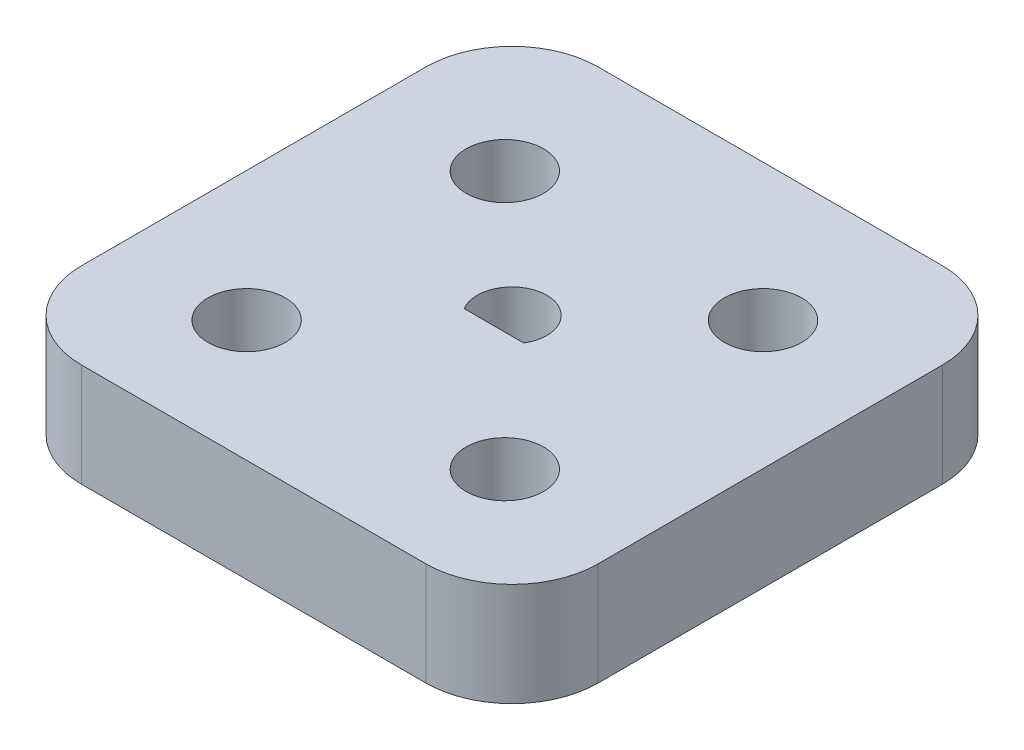
ISO-10303-21;
HEADER;
FILE_DESCRIPTION(('STEP AP214'),'2;1');
FILE_NAME('part.step','',(''),(''),'','','');
FILE_SCHEMA(('AUTOMOTIVE_DESIGN { 1 0 10303 214 1 1 1 1 }'));
ENDSEC;
DATA;
#1=APPLICATION_CONTEXT('core data for automotive mechanical design processes');
#2=APPLICATION_PROTOCOL_DEFINITION('international standard','automotive_design',2000,#1);
#3=PRODUCT_CONTEXT('',#1,'mechanical');
#4=PRODUCT('Part','Part','',(#3));
#5=PRODUCT_RELATED_PRODUCT_CATEGORY('part','',(#4));
#6=PRODUCT_DEFINITION_FORMATION('','',#4);
#7=PRODUCT_DEFINITION_CONTEXT('part definition',#1,'design');
#8=PRODUCT_DEFINITION('design','',#6,#7);
#9=PRODUCT_DEFINITION_SHAPE('','',#8);
#10=(LENGTH_UNIT() NAMED_UNIT(*) SI_UNIT(.MILLI.,.METRE.));
#11=(NAMED_UNIT(*) PLANE_ANGLE_UNIT() SI_UNIT($,.RADIAN.));
#12=(NAMED_UNIT(*) SI_UNIT($,.STERADIAN.) SOLID_ANGLE_UNIT());
#13=UNCERTAINTY_MEASURE_WITH_UNIT(LENGTH_MEASURE(1.E-05),#10,'distance_accuracy_value','');
#14=(GEOMETRIC_REPRESENTATION_CONTEXT(3) GLOBAL_UNCERTAINTY_ASSIGNED_CONTEXT((#13)) GLOBAL_UNIT_ASSIGNED_CONTEXT((#10,
#11,#12)) REPRESENTATION_CONTEXT('',''));
#15=CARTESIAN_POINT('',(0.,0.,0.));
#16=DIRECTION('',(0.,0.,1.));
#17=DIRECTION('',(1.,0.,0.));
#18=AXIS2_PLACEMENT_3D('',#15,#16,#17);
#19=CARTESIAN_POINT('',(15.,6.,0.));
#20=DIRECTION('',(1.,0.,0.));
#21=DIRECTION('',(0.,0.,-1.));
#22=AXIS2_PLACEMENT_3D('',#19,#20,#21);
#23=PLANE('',#22);
#24=DIRECTION('',(0.,0.,1.));
#25=VECTOR('',#24,1.);
#26=CARTESIAN_POINT('',(15.,0.,0.));
#27=LINE('',#26,#25);
#28=CARTESIAN_POINT('',(15.,0.,-10.));
#29=VERTEX_POINT('',#28);
#30=CARTESIAN_POINT('',(15.,0.,10.));
#31=VERTEX_POINT('',#30);
#32=EDGE_CURVE('E150',#29,#31,#27,.T.);
#33=ORIENTED_EDGE('',*,*,#32,.F.);
#34=DIRECTION('',(0.,-1.,0.));
#35=VECTOR('',#34,1.);
#36=CARTESIAN_POINT('',(15.,6.,-10.));
#37=LINE('',#36,#35);
#38=CARTESIAN_POINT('',(15.,6.,-10.));
#39=VERTEX_POINT('',#38);
#40=EDGE_CURVE('E188',#29,#39,#37,.F.);
#41=ORIENTED_EDGE('',*,*,#40,.T.);
#42=DIRECTION('',(0.,0.,1.));
#43=VECTOR('',#42,1.);
#44=CARTESIAN_POINT('',(15.,6.,0.));
#45=LINE('',#44,#43);
#46=CARTESIAN_POINT('',(15.,6.,10.));
#47=VERTEX_POINT('',#46);
#48=EDGE_CURVE('E133',#39,#47,#45,.T.);
#49=ORIENTED_EDGE('',*,*,#48,.T.);
#50=DIRECTION('',(0.,-1.,0.));
#51=VECTOR('',#50,1.);
#52=CARTESIAN_POINT('',(15.,0.,10.));
#53=LINE('',#52,#51);
#54=EDGE_CURVE('E185',#47,#31,#53,.T.);
#55=ORIENTED_EDGE('',*,*,#54,.T.);
#56=EDGE_LOOP('',(#33,#41,#49,#55));
#57=FACE_BOUND('',#56,.T.);
#58=ADVANCED_FACE('F35',(#57),#23,.T.);
#59=CARTESIAN_POINT('',(0.,6.,-15.));
#60=DIRECTION('',(0.,0.,-1.));
#61=DIRECTION('',(-1.,0.,0.));
#62=AXIS2_PLACEMENT_3D('',#59,#60,#61);
#63=PLANE('',#62);
#64=DIRECTION('',(1.,0.,0.));
#65=VECTOR('',#64,1.);
#66=CARTESIAN_POINT('',(0.,0.,-15.));
#67=LINE('',#66,#65);
#68=CARTESIAN_POINT('',(-10.,0.,-15.));
#69=VERTEX_POINT('',#68);
#70=CARTESIAN_POINT('',(10.,0.,-15.));
#71=VERTEX_POINT('',#70);
#72=EDGE_CURVE('E153',#69,#71,#67,.T.);
#73=ORIENTED_EDGE('',*,*,#72,.F.);
#74=DIRECTION('',(0.,-1.,0.));
#75=VECTOR('',#74,1.);
#76=CARTESIAN_POINT('',(-10.,6.,-15.));
#77=LINE('',#76,#75);
#78=CARTESIAN_POINT('',(-10.,6.,-15.));
#79=VERTEX_POINT('',#78);
#80=EDGE_CURVE('E176',#69,#79,#77,.F.);
#81=ORIENTED_EDGE('',*,*,#80,.T.);
#82=DIRECTION('',(1.,0.,0.));
#83=VECTOR('',#82,1.);
#84=CARTESIAN_POINT('',(0.,6.,-15.));
#85=LINE('',#84,#83);
#86=CARTESIAN_POINT('',(10.,6.,-15.));
#87=VERTEX_POINT('',#86);
#88=EDGE_CURVE('E136',#79,#87,#85,.T.);
#89=ORIENTED_EDGE('',*,*,#88,.T.);
#90=DIRECTION('',(0.,-1.,0.));
#91=VECTOR('',#90,1.);
#92=CARTESIAN_POINT('',(10.,6.,-15.));
#93=LINE('',#92,#91);
#94=EDGE_CURVE('E173',#87,#71,#93,.T.);
#95=ORIENTED_EDGE('',*,*,#94,.T.);
#96=EDGE_LOOP('',(#73,#81,#89,#95));
#97=FACE_BOUND('',#96,.T.);
#98=ADVANCED_FACE('F202',(#97),#63,.T.);
#99=CARTESIAN_POINT('',(-15.,6.,0.));
#100=DIRECTION('',(1.,0.,0.));
#101=DIRECTION('',(0.,0.,-1.));
#102=AXIS2_PLACEMENT_3D('',#99,#100,#101);
#103=PLANE('',#102);
#104=DIRECTION('',(0.,0.,1.));
#105=VECTOR('',#104,1.);
#106=CARTESIAN_POINT('',(-15.,6.,0.));
#107=LINE('',#106,#105);
#108=CARTESIAN_POINT('',(-15.,6.,-10.));
#109=VERTEX_POINT('',#108);
#110=CARTESIAN_POINT('',(-15.,6.,10.));
#111=VERTEX_POINT('',#110);
#112=EDGE_CURVE('E142',#109,#111,#107,.T.);
#113=ORIENTED_EDGE('',*,*,#112,.F.);
#114=DIRECTION('',(0.,-1.,0.));
#115=VECTOR('',#114,1.);
#116=CARTESIAN_POINT('',(-15.,0.,-10.));
#117=LINE('',#116,#115);
#118=CARTESIAN_POINT('',(-15.,0.,-10.));
#119=VERTEX_POINT('',#118);
#120=EDGE_CURVE('E162',#109,#119,#117,.T.);
#121=ORIENTED_EDGE('',*,*,#120,.T.);
#122=DIRECTION('',(0.,0.,1.));
#123=VECTOR('',#122,1.);
#124=CARTESIAN_POINT('',(-15.,0.,0.));
#125=LINE('',#124,#123);
#126=CARTESIAN_POINT('',(-15.,0.,10.));
#127=VERTEX_POINT('',#126);
#128=EDGE_CURVE('E156',#119,#127,#125,.T.);
#129=ORIENTED_EDGE('',*,*,#128,.T.);
#130=DIRECTION('',(0.,-1.,0.));
#131=VECTOR('',#130,1.);
#132=CARTESIAN_POINT('',(-15.,6.,10.));
#133=LINE('',#132,#131);
#134=EDGE_CURVE('E124',#127,#111,#133,.F.);
#135=ORIENTED_EDGE('',*,*,#134,.T.);
#136=EDGE_LOOP('',(#113,#121,#129,#135));
#137=FACE_BOUND('',#136,.T.);
#138=ADVANCED_FACE('F213',(#137),#103,.F.);
#139=CARTESIAN_POINT('',(0.,6.,0.));
#140=DIRECTION('',(0.,-1.,0.));
#141=DIRECTION('',(0.,0.,-1.));
#142=AXIS2_PLACEMENT_3D('',#139,#140,#141);
#143=CYLINDRICAL_SURFACE('',#142,2.025);
#144=CARTESIAN_POINT('',(0.,0.,0.));
#145=DIRECTION('',(0.,1.,0.));
#146=DIRECTION('',(0.,0.,1.));
#147=AXIS2_PLACEMENT_3D('',#144,#145,#146);
#148=CIRCLE('',#147,2.025);
#149=CARTESIAN_POINT('',(1.73150945709228,0.,1.05));
#150=VERTEX_POINT('',#149);
#151=CARTESIAN_POINT('',(-1.73150945709228,0.,1.05));
#152=VERTEX_POINT('',#151);
#153=EDGE_CURVE('E119',#150,#152,#148,.T.);
#154=ORIENTED_EDGE('',*,*,#153,.F.);
#155=DIRECTION('',(0.,-1.,0.));
#156=VECTOR('',#155,1.);
#157=CARTESIAN_POINT('',(1.73150945709228,6.,1.05));
#158=LINE('',#157,#156);
#159=CARTESIAN_POINT('',(1.73150945709228,6.,1.05));
#160=VERTEX_POINT('',#159);
#161=EDGE_CURVE('E113',#160,#150,#158,.T.);
#162=ORIENTED_EDGE('',*,*,#161,.F.);
#163=CARTESIAN_POINT('',(0.,6.,0.));
#164=DIRECTION('',(0.,1.,0.));
#165=DIRECTION('',(0.,0.,1.));
#166=AXIS2_PLACEMENT_3D('',#163,#164,#165);
#167=CIRCLE('',#166,2.025);
#168=CARTESIAN_POINT('',(-1.73150945709228,6.,1.05));
#169=VERTEX_POINT('',#168);
#170=EDGE_CURVE('E116',#160,#169,#167,.T.);
#171=ORIENTED_EDGE('',*,*,#170,.T.);
#172=DIRECTION('',(0.,-1.,0.));
#173=VECTOR('',#172,1.);
#174=CARTESIAN_POINT('',(-1.73150945709228,6.,1.05));
#175=LINE('',#174,#173);
#176=EDGE_CURVE('E125',#169,#152,#175,.T.);
#177=ORIENTED_EDGE('',*,*,#176,.T.);
#178=EDGE_LOOP('',(#154,#162,#171,#177));
#179=FACE_BOUND('',#178,.T.);
#180=ADVANCED_FACE('F115',(#179),#143,.F.);
#181=CARTESIAN_POINT('',(0.,6.,1.05));
#182=DIRECTION('',(0.,0.,-1.));
#183=DIRECTION('',(-1.,0.,0.));
#184=AXIS2_PLACEMENT_3D('',#181,#182,#183);
#185=PLANE('',#184);
#186=DIRECTION('',(1.,0.,0.));
#187=VECTOR('',#186,1.);
#188=CARTESIAN_POINT('',(0.,0.,1.05));
#189=LINE('',#188,#187);
#190=EDGE_CURVE('E147',#152,#150,#189,.T.);
#191=ORIENTED_EDGE('',*,*,#190,.F.);
#192=ORIENTED_EDGE('',*,*,#176,.F.);
#193=DIRECTION('',(1.,0.,0.));
#194=VECTOR('',#193,1.);
#195=CARTESIAN_POINT('',(0.,6.,1.05));
#196=LINE('',#195,#194);
#197=EDGE_CURVE('E129',#169,#160,#196,.T.);
#198=ORIENTED_EDGE('',*,*,#197,.T.);
#199=ORIENTED_EDGE('',*,*,#161,.T.);
#200=EDGE_LOOP('',(#191,#192,#198,#199));
#201=FACE_BOUND('',#200,.T.);
#202=ADVANCED_FACE('F132',(#201),#185,.T.);
#203=CARTESIAN_POINT('',(0.,6.,15.));
#204=DIRECTION('',(0.,0.,-1.));
#205=DIRECTION('',(-1.,0.,0.));
#206=AXIS2_PLACEMENT_3D('',#203,#204,#205);
#207=PLANE('',#206);
#208=DIRECTION('',(1.,0.,0.));
#209=VECTOR('',#208,1.);
#210=CARTESIAN_POINT('',(0.,6.,15.));
#211=LINE('',#210,#209);
#212=CARTESIAN_POINT('',(-10.,6.,15.));
#213=VERTEX_POINT('',#212);
#214=CARTESIAN_POINT('',(10.,6.,15.));
#215=VERTEX_POINT('',#214);
#216=EDGE_CURVE('E144',#213,#215,#211,.T.);
#217=ORIENTED_EDGE('',*,*,#216,.F.);
#218=DIRECTION('',(0.,-1.,0.));
#219=VECTOR('',#218,1.);
#220=CARTESIAN_POINT('',(-10.,6.,15.));
#221=LINE('',#220,#219);
#222=CARTESIAN_POINT('',(-10.,0.,15.));
#223=VERTEX_POINT('',#222);
#224=EDGE_CURVE('E11',#213,#223,#221,.T.);
#225=ORIENTED_EDGE('',*,*,#224,.T.);
#226=DIRECTION('',(1.,0.,0.));
#227=VECTOR('',#226,1.);
#228=CARTESIAN_POINT('',(0.,0.,15.));
#229=LINE('',#228,#227);
#230=CARTESIAN_POINT('',(10.,0.,15.));
#231=VERTEX_POINT('',#230);
#232=EDGE_CURVE('E130',#223,#231,#229,.T.);
#233=ORIENTED_EDGE('',*,*,#232,.T.);
#234=DIRECTION('',(0.,-1.,0.));
#235=VECTOR('',#234,1.);
#236=CARTESIAN_POINT('',(10.,6.,15.));
#237=LINE('',#236,#235);
#238=EDGE_CURVE('E43',#231,#215,#237,.F.);
#239=ORIENTED_EDGE('',*,*,#238,.T.);
#240=EDGE_LOOP('',(#217,#225,#233,#239));
#241=FACE_BOUND('',#240,.T.);
#242=ADVANCED_FACE('F219',(#241),#207,.F.);
#243=CARTESIAN_POINT('',(0.,6.,0.));
#244=DIRECTION('',(0.,1.,0.));
#245=DIRECTION('',(0.,0.,1.));
#246=AXIS2_PLACEMENT_3D('',#243,#244,#245);
#247=PLANE('',#246);
#248=CARTESIAN_POINT('',(-7.46768441613738,6.,-7.05158171030384));
#249=DIRECTION('',(0.,1.,0.));
#250=DIRECTION('',(0.,0.,1.));
#251=AXIS2_PLACEMENT_3D('',#248,#249,#250);
#252=CIRCLE('',#251,2.2479);
#253=CARTESIAN_POINT('',(-7.46768441613738,6.,-4.80368171030385));
#254=VERTEX_POINT('',#253);
#255=EDGE_CURVE('E367',#254,#254,#252,.T.);
#256=ORIENTED_EDGE('',*,*,#255,.F.);
#257=EDGE_LOOP('',(#256));
#258=FACE_BOUND('',#257,.T.);
#259=CARTESIAN_POINT('',(7.53231558386262,6.,-7.05158171030384));
#260=DIRECTION('',(0.,1.,0.));
#261=DIRECTION('',(0.,0.,1.));
#262=AXIS2_PLACEMENT_3D('',#259,#260,#261);
#263=CIRCLE('',#262,2.2479);
#264=CARTESIAN_POINT('',(7.53231558386262,6.,-4.80368171030384));
#265=VERTEX_POINT('',#264);
#266=EDGE_CURVE('E369',#265,#265,#263,.T.);
#267=ORIENTED_EDGE('',*,*,#266,.F.);
#268=EDGE_LOOP('',(#267));
#269=FACE_BOUND('',#268,.T.);
#270=CARTESIAN_POINT('',(-7.46768441613738,6.,7.94841828969615));
#271=DIRECTION('',(0.,1.,0.));
#272=DIRECTION('',(0.,0.,1.));
#273=AXIS2_PLACEMENT_3D('',#270,#271,#272);
#274=CIRCLE('',#273,2.2479);
#275=CARTESIAN_POINT('',(-7.46768441613738,6.,10.1963182896962));
#276=VERTEX_POINT('',#275);
#277=EDGE_CURVE('E377',#276,#276,#274,.T.);
#278=ORIENTED_EDGE('',*,*,#277,.F.);
#279=EDGE_LOOP('',(#278));
#280=FACE_BOUND('',#279,.T.);
#281=CARTESIAN_POINT('',(7.53231558386262,6.,7.94841828969615));
#282=DIRECTION('',(0.,1.,0.));
#283=DIRECTION('',(0.,0.,1.));
#284=AXIS2_PLACEMENT_3D('',#281,#282,#283);
#285=CIRCLE('',#284,2.2479);
#286=CARTESIAN_POINT('',(7.53231558386262,6.,10.1963182896962));
#287=VERTEX_POINT('',#286);
#288=EDGE_CURVE('E383',#287,#287,#285,.T.);
#289=ORIENTED_EDGE('',*,*,#288,.F.);
#290=EDGE_LOOP('',(#289));
#291=FACE_BOUND('',#290,.T.);
#292=ORIENTED_EDGE('',*,*,#170,.F.);
#293=ORIENTED_EDGE('',*,*,#197,.F.);
#294=EDGE_LOOP('',(#292,#293));
#295=FACE_BOUND('',#294,.T.);
#296=ORIENTED_EDGE('',*,*,#88,.F.);
#297=CARTESIAN_POINT('',(-10.,6.,-10.));
#298=DIRECTION('',(0.,1.,0.));
#299=DIRECTION('',(0.,0.,1.));
#300=AXIS2_PLACEMENT_3D('',#297,#298,#299);
#301=CIRCLE('',#300,5.);
#302=EDGE_CURVE('E183',#79,#109,#301,.T.);
#303=ORIENTED_EDGE('',*,*,#302,.T.);
#304=ORIENTED_EDGE('',*,*,#112,.T.);
#305=CARTESIAN_POINT('',(-10.,6.,10.));
#306=DIRECTION('',(0.,1.,0.));
#307=DIRECTION('',(0.,0.,1.));
#308=AXIS2_PLACEMENT_3D('',#305,#306,#307);
#309=CIRCLE('',#308,5.);
#310=EDGE_CURVE('E56',#111,#213,#309,.T.);
#311=ORIENTED_EDGE('',*,*,#310,.T.);
#312=ORIENTED_EDGE('',*,*,#216,.T.);
#313=CARTESIAN_POINT('',(10.,6.,10.));
#314=DIRECTION('',(0.,1.,0.));
#315=DIRECTION('',(0.,0.,1.));
#316=AXIS2_PLACEMENT_3D('',#313,#314,#315);
#317=CIRCLE('',#316,5.);
#318=EDGE_CURVE('E178',#215,#47,#317,.T.);
#319=ORIENTED_EDGE('',*,*,#318,.T.);
#320=ORIENTED_EDGE('',*,*,#48,.F.);
#321=CARTESIAN_POINT('',(10.,6.,-10.));
#322=DIRECTION('',(0.,1.,0.));
#323=DIRECTION('',(0.,0.,1.));
#324=AXIS2_PLACEMENT_3D('',#321,#322,#323);
#325=CIRCLE('',#324,5.);
#326=EDGE_CURVE('E181',#39,#87,#325,.T.);
#327=ORIENTED_EDGE('',*,*,#326,.T.);
#328=EDGE_LOOP('',(#296,#303,#304,#311,#312,#319,#320,#327));
#329=FACE_BOUND('',#328,.T.);
#330=ADVANCED_FACE('F128',(#258,#269,#280,#291,#295,#329),#247,.T.);
#331=CARTESIAN_POINT('',(0.,0.,0.));
#332=DIRECTION('',(0.,1.,0.));
#333=DIRECTION('',(0.,0.,1.));
#334=AXIS2_PLACEMENT_3D('',#331,#332,#333);
#335=PLANE('',#334);
#336=CARTESIAN_POINT('',(-7.46768441613738,0.,-7.05158171030384));
#337=DIRECTION('',(0.,1.,0.));
#338=DIRECTION('',(0.,0.,1.));
#339=AXIS2_PLACEMENT_3D('',#336,#337,#338);
#340=CIRCLE('',#339,2.2479);
#341=CARTESIAN_POINT('',(-7.46768441613738,0.,-4.80368171030385));
#342=VERTEX_POINT('',#341);
#343=EDGE_CURVE('E364',#342,#342,#340,.T.);
#344=ORIENTED_EDGE('',*,*,#343,.T.);
#345=EDGE_LOOP('',(#344));
#346=FACE_BOUND('',#345,.T.);
#347=CARTESIAN_POINT('',(7.53231558386262,0.,-7.05158171030384));
#348=DIRECTION('',(0.,1.,0.));
#349=DIRECTION('',(0.,0.,1.));
#350=AXIS2_PLACEMENT_3D('',#347,#348,#349);
#351=CIRCLE('',#350,2.2479);
#352=CARTESIAN_POINT('',(7.53231558386262,0.,-4.80368171030385));
#353=VERTEX_POINT('',#352);
#354=EDGE_CURVE('E374',#353,#353,#351,.T.);
#355=ORIENTED_EDGE('',*,*,#354,.T.);
#356=EDGE_LOOP('',(#355));
#357=FACE_BOUND('',#356,.T.);
#358=CARTESIAN_POINT('',(-7.46768441613738,0.,7.94841828969615));
#359=DIRECTION('',(0.,1.,0.));
#360=DIRECTION('',(0.,0.,1.));
#361=AXIS2_PLACEMENT_3D('',#358,#359,#360);
#362=CIRCLE('',#361,2.2479);
#363=CARTESIAN_POINT('',(-7.46768441613738,0.,10.1963182896962));
#364=VERTEX_POINT('',#363);
#365=EDGE_CURVE('E380',#364,#364,#362,.T.);
#366=ORIENTED_EDGE('',*,*,#365,.T.);
#367=EDGE_LOOP('',(#366));
#368=FACE_BOUND('',#367,.T.);
#369=CARTESIAN_POINT('',(7.53231558386262,0.,7.94841828969615));
#370=DIRECTION('',(0.,1.,0.));
#371=DIRECTION('',(0.,0.,1.));
#372=AXIS2_PLACEMENT_3D('',#369,#370,#371);
#373=CIRCLE('',#372,2.2479);
#374=CARTESIAN_POINT('',(7.53231558386262,0.,10.1963182896962));
#375=VERTEX_POINT('',#374);
#376=EDGE_CURVE('E148',#375,#375,#373,.T.);
#377=ORIENTED_EDGE('',*,*,#376,.T.);
#378=EDGE_LOOP('',(#377));
#379=FACE_BOUND('',#378,.T.);
#380=ORIENTED_EDGE('',*,*,#153,.T.);
#381=ORIENTED_EDGE('',*,*,#190,.T.);
#382=EDGE_LOOP('',(#380,#381));
#383=FACE_BOUND('',#382,.T.);
#384=ORIENTED_EDGE('',*,*,#128,.F.);
#385=CARTESIAN_POINT('',(-10.,0.,-10.));
#386=DIRECTION('',(0.,1.,0.));
#387=DIRECTION('',(0.,0.,1.));
#388=AXIS2_PLACEMENT_3D('',#385,#386,#387);
#389=CIRCLE('',#388,5.);
#390=EDGE_CURVE('E171',#119,#69,#389,.F.);
#391=ORIENTED_EDGE('',*,*,#390,.T.);
#392=ORIENTED_EDGE('',*,*,#72,.T.);
#393=CARTESIAN_POINT('',(10.,0.,-10.));
#394=DIRECTION('',(0.,1.,0.));
#395=DIRECTION('',(0.,0.,1.));
#396=AXIS2_PLACEMENT_3D('',#393,#394,#395);
#397=CIRCLE('',#396,5.);
#398=EDGE_CURVE('E169',#71,#29,#397,.F.);
#399=ORIENTED_EDGE('',*,*,#398,.T.);
#400=ORIENTED_EDGE('',*,*,#32,.T.);
#401=CARTESIAN_POINT('',(10.,0.,10.));
#402=DIRECTION('',(0.,1.,0.));
#403=DIRECTION('',(0.,0.,1.));
#404=AXIS2_PLACEMENT_3D('',#401,#402,#403);
#405=CIRCLE('',#404,5.);
#406=EDGE_CURVE('E165',#31,#231,#405,.F.);
#407=ORIENTED_EDGE('',*,*,#406,.T.);
#408=ORIENTED_EDGE('',*,*,#232,.F.);
#409=CARTESIAN_POINT('',(-10.,0.,10.));
#410=DIRECTION('',(0.,1.,0.));
#411=DIRECTION('',(0.,0.,1.));
#412=AXIS2_PLACEMENT_3D('',#409,#410,#411);
#413=CIRCLE('',#412,5.);
#414=EDGE_CURVE('E167',#223,#127,#413,.F.);
#415=ORIENTED_EDGE('',*,*,#414,.T.);
#416=EDGE_LOOP('',(#384,#391,#392,#399,#400,#407,#408,#415));
#417=FACE_BOUND('',#416,.T.);
#418=ADVANCED_FACE('F206',(#346,#357,#368,#379,#383,#417),#335,.F.);
#419=CARTESIAN_POINT('',(-10.,6.,-10.));
#420=DIRECTION('',(0.,1.,0.));
#421=DIRECTION('',(0.,0.,1.));
#422=AXIS2_PLACEMENT_3D('',#419,#420,#421);
#423=CYLINDRICAL_SURFACE('',#422,5.);
#424=ORIENTED_EDGE('',*,*,#302,.F.);
#425=ORIENTED_EDGE('',*,*,#80,.F.);
#426=ORIENTED_EDGE('',*,*,#390,.F.);
#427=ORIENTED_EDGE('',*,*,#120,.F.);
#428=EDGE_LOOP('',(#424,#425,#426,#427));
#429=FACE_BOUND('',#428,.T.);
#430=ADVANCED_FACE('F210',(#429),#423,.T.);
#431=CARTESIAN_POINT('',(10.,6.,-10.));
#432=DIRECTION('',(0.,-1.,0.));
#433=DIRECTION('',(0.,0.,-1.));
#434=AXIS2_PLACEMENT_3D('',#431,#432,#433);
#435=CYLINDRICAL_SURFACE('',#434,5.);
#436=ORIENTED_EDGE('',*,*,#326,.F.);
#437=ORIENTED_EDGE('',*,*,#40,.F.);
#438=ORIENTED_EDGE('',*,*,#398,.F.);
#439=ORIENTED_EDGE('',*,*,#94,.F.);
#440=EDGE_LOOP('',(#436,#437,#438,#439));
#441=FACE_BOUND('',#440,.T.);
#442=ADVANCED_FACE('F199',(#441),#435,.T.);
#443=CARTESIAN_POINT('',(-10.,6.,10.));
#444=DIRECTION('',(0.,-1.,0.));
#445=DIRECTION('',(0.,0.,-1.));
#446=AXIS2_PLACEMENT_3D('',#443,#444,#445);
#447=CYLINDRICAL_SURFACE('',#446,5.);
#448=ORIENTED_EDGE('',*,*,#310,.F.);
#449=ORIENTED_EDGE('',*,*,#134,.F.);
#450=ORIENTED_EDGE('',*,*,#414,.F.);
#451=ORIENTED_EDGE('',*,*,#224,.F.);
#452=EDGE_LOOP('',(#448,#449,#450,#451));
#453=FACE_BOUND('',#452,.T.);
#454=ADVANCED_FACE('F217',(#453),#447,.T.);
#455=CARTESIAN_POINT('',(10.,6.,10.));
#456=DIRECTION('',(0.,1.,0.));
#457=DIRECTION('',(0.,0.,1.));
#458=AXIS2_PLACEMENT_3D('',#455,#456,#457);
#459=CYLINDRICAL_SURFACE('',#458,5.);
#460=ORIENTED_EDGE('',*,*,#318,.F.);
#461=ORIENTED_EDGE('',*,*,#238,.F.);
#462=ORIENTED_EDGE('',*,*,#406,.F.);
#463=ORIENTED_EDGE('',*,*,#54,.F.);
#464=EDGE_LOOP('',(#460,#461,#462,#463));
#465=FACE_BOUND('',#464,.T.);
#466=ADVANCED_FACE('F37',(#465),#459,.T.);
#467=CARTESIAN_POINT('',(7.53231558386262,6.,7.94841828969615));
#468=DIRECTION('',(0.,1.,0.));
#469=DIRECTION('',(0.,0.,1.));
#470=AXIS2_PLACEMENT_3D('',#467,#468,#469);
#471=CYLINDRICAL_SURFACE('',#470,2.2479);
#472=ORIENTED_EDGE('',*,*,#376,.F.);
#473=EDGE_LOOP('',(#472));
#474=FACE_BOUND('',#473,.T.);
#475=ORIENTED_EDGE('',*,*,#288,.T.);
#476=EDGE_LOOP('',(#475));
#477=FACE_BOUND('',#476,.T.);
#478=ADVANCED_FACE('F222',(#474,#477),#471,.F.);
#479=CARTESIAN_POINT('',(-7.46768441613738,6.,7.94841828969615));
#480=DIRECTION('',(0.,1.,0.));
#481=DIRECTION('',(0.,0.,1.));
#482=AXIS2_PLACEMENT_3D('',#479,#480,#481);
#483=CYLINDRICAL_SURFACE('',#482,2.2479);
#484=ORIENTED_EDGE('',*,*,#365,.F.);
#485=EDGE_LOOP('',(#484));
#486=FACE_BOUND('',#485,.T.);
#487=ORIENTED_EDGE('',*,*,#277,.T.);
#488=EDGE_LOOP('',(#487));
#489=FACE_BOUND('',#488,.T.);
#490=ADVANCED_FACE('F227',(#486,#489),#483,.F.);
#491=CARTESIAN_POINT('',(7.53231558386262,6.,-7.05158171030384));
#492=DIRECTION('',(0.,1.,0.));
#493=DIRECTION('',(0.,0.,1.));
#494=AXIS2_PLACEMENT_3D('',#491,#492,#493);
#495=CYLINDRICAL_SURFACE('',#494,2.2479);
#496=ORIENTED_EDGE('',*,*,#354,.F.);
#497=EDGE_LOOP('',(#496));
#498=FACE_BOUND('',#497,.T.);
#499=ORIENTED_EDGE('',*,*,#266,.T.);
#500=EDGE_LOOP('',(#499));
#501=FACE_BOUND('',#500,.T.);
#502=ADVANCED_FACE('F294',(#498,#501),#495,.F.);
#503=CARTESIAN_POINT('',(-7.46768441613738,6.,-7.05158171030384));
#504=DIRECTION('',(0.,1.,0.));
#505=DIRECTION('',(0.,0.,1.));
#506=AXIS2_PLACEMENT_3D('',#503,#504,#505);
#507=CYLINDRICAL_SURFACE('',#506,2.2479);
#508=ORIENTED_EDGE('',*,*,#343,.F.);
#509=EDGE_LOOP('',(#508));
#510=FACE_BOUND('',#509,.T.);
#511=ORIENTED_EDGE('',*,*,#255,.T.);
#512=EDGE_LOOP('',(#511));
#513=FACE_BOUND('',#512,.T.);
#514=ADVANCED_FACE('F304',(#510,#513),#507,.F.);
#515=CLOSED_SHELL('',(#58,#98,#138,#180,#202,#242,#330,#418,#430,#442,#454,#466,#478,#490,#502,#514));
#516=MANIFOLD_SOLID_BREP('B2',#515);
#517=ADVANCED_BREP_SHAPE_REPRESENTATION('',(#18,#516),#14);
#518=SHAPE_DEFINITION_REPRESENTATION(#9,#517);
ENDSEC;
END-ISO-10303-21;
